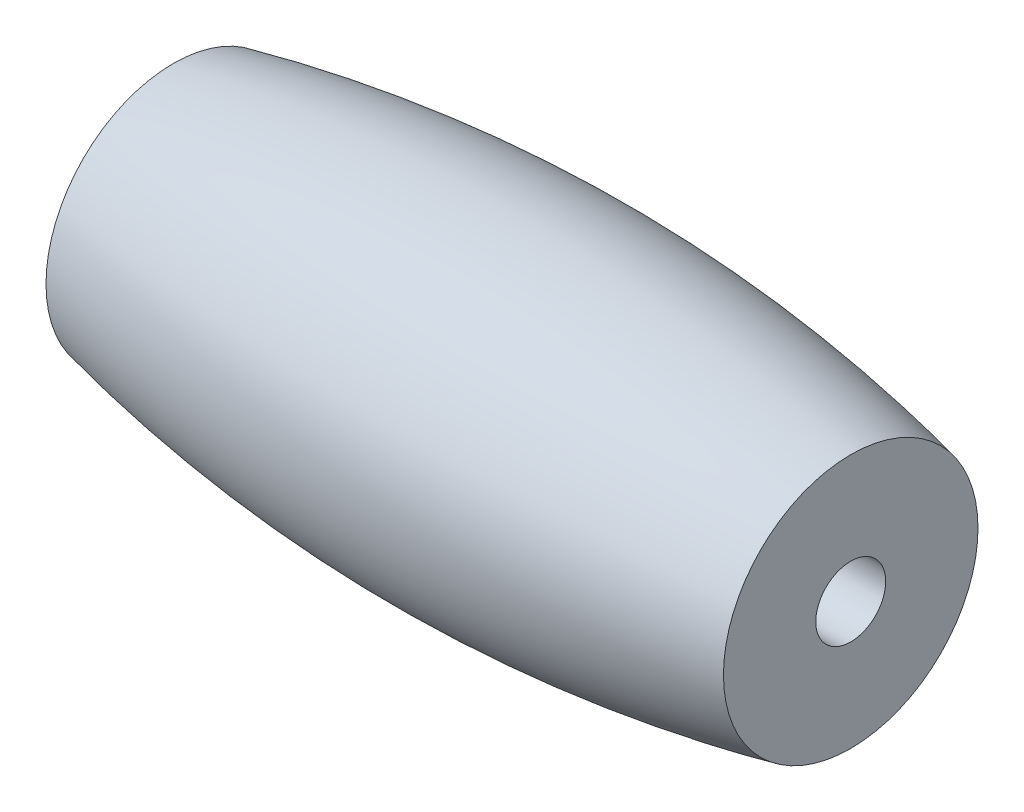
ISO-10303-21;
HEADER;
FILE_DESCRIPTION(('STEP AP214'),'2;1');
FILE_NAME('part.step','',(''),(''),'','','');
FILE_SCHEMA(('AUTOMOTIVE_DESIGN { 1 0 10303 214 1 1 1 1 }'));
ENDSEC;
DATA;
#1=APPLICATION_CONTEXT('core data for automotive mechanical design processes');
#2=APPLICATION_PROTOCOL_DEFINITION('international standard','automotive_design',2000,#1);
#3=PRODUCT_CONTEXT('',#1,'mechanical');
#4=PRODUCT('Part','Part','',(#3));
#5=PRODUCT_RELATED_PRODUCT_CATEGORY('part','',(#4));
#6=PRODUCT_DEFINITION_FORMATION('','',#4);
#7=PRODUCT_DEFINITION_CONTEXT('part definition',#1,'design');
#8=PRODUCT_DEFINITION('design','',#6,#7);
#9=PRODUCT_DEFINITION_SHAPE('','',#8);
#10=(LENGTH_UNIT() NAMED_UNIT(*) SI_UNIT(.MILLI.,.METRE.));
#11=(NAMED_UNIT(*) PLANE_ANGLE_UNIT() SI_UNIT($,.RADIAN.));
#12=(NAMED_UNIT(*) SI_UNIT($,.STERADIAN.) SOLID_ANGLE_UNIT());
#13=UNCERTAINTY_MEASURE_WITH_UNIT(LENGTH_MEASURE(1.E-05),#10,'distance_accuracy_value','');
#14=(GEOMETRIC_REPRESENTATION_CONTEXT(3) GLOBAL_UNCERTAINTY_ASSIGNED_CONTEXT((#13)) GLOBAL_UNIT_ASSIGNED_CONTEXT((#10,
#11,#12)) REPRESENTATION_CONTEXT('',''));
#15=CARTESIAN_POINT('',(0.,0.,0.));
#16=DIRECTION('',(0.,0.,1.));
#17=DIRECTION('',(1.,0.,0.));
#18=AXIS2_PLACEMENT_3D('',#15,#16,#17);
#19=CARTESIAN_POINT('',(-15.5,5.8237248385031,0.));
#20=DIRECTION('',(1.,0.,0.));
#21=DIRECTION('',(0.,0.,-1.));
#22=AXIS2_PLACEMENT_3D('',#19,#20,#21);
#23=PLANE('',#22);
#24=CARTESIAN_POINT('',(-15.5,0.,0.));
#25=DIRECTION('',(-1.,0.,0.));
#26=DIRECTION('',(0.,0.,1.));
#27=AXIS2_PLACEMENT_3D('',#24,#25,#26);
#28=CIRCLE('',#27,1.6);
#29=CARTESIAN_POINT('',(-15.5,0.,1.6));
#30=VERTEX_POINT('',#29);
#31=EDGE_CURVE('E10',#30,#30,#28,.T.);
#32=ORIENTED_EDGE('',*,*,#31,.F.);
#33=EDGE_LOOP('',(#32));
#34=FACE_BOUND('',#33,.T.);
#35=CARTESIAN_POINT('',(-15.5,0.,0.));
#36=DIRECTION('',(-1.,0.,0.));
#37=DIRECTION('',(0.,0.,1.));
#38=AXIS2_PLACEMENT_3D('',#35,#36,#37);
#39=CIRCLE('',#38,5.8237248385031);
#40=CARTESIAN_POINT('',(-15.5,0.,5.8237248385031));
#41=VERTEX_POINT('',#40);
#42=EDGE_CURVE('E60',#41,#41,#39,.T.);
#43=ORIENTED_EDGE('',*,*,#42,.T.);
#44=EDGE_LOOP('',(#43));
#45=FACE_BOUND('',#44,.T.);
#46=ADVANCED_FACE('F43',(#34,#45),#23,.F.);
#47=CARTESIAN_POINT('',(-31.,0.,0.));
#48=DIRECTION('',(-1.,0.,0.));
#49=DIRECTION('',(0.,0.,1.));
#50=AXIS2_PLACEMENT_3D('',#47,#48,#49);
#51=CYLINDRICAL_SURFACE('',#50,1.6);
#52=CARTESIAN_POINT('',(15.5,0.,0.));
#53=DIRECTION('',(-1.,0.,0.));
#54=DIRECTION('',(0.,0.,1.));
#55=AXIS2_PLACEMENT_3D('',#52,#53,#54);
#56=CIRCLE('',#55,1.6);
#57=CARTESIAN_POINT('',(15.5,0.,1.6));
#58=VERTEX_POINT('',#57);
#59=EDGE_CURVE('E50',#58,#58,#56,.T.);
#60=ORIENTED_EDGE('',*,*,#59,.F.);
#61=EDGE_LOOP('',(#60));
#62=FACE_BOUND('',#61,.T.);
#63=ORIENTED_EDGE('',*,*,#31,.T.);
#64=EDGE_LOOP('',(#63));
#65=FACE_BOUND('',#64,.T.);
#66=ADVANCED_FACE('F76',(#62,#65),#51,.F.);
#67=CARTESIAN_POINT('',(15.5,1.6,0.));
#68=DIRECTION('',(-1.,0.,0.));
#69=DIRECTION('',(0.,0.,1.));
#70=AXIS2_PLACEMENT_3D('',#67,#68,#69);
#71=PLANE('',#70);
#72=CARTESIAN_POINT('',(15.5,0.,0.));
#73=DIRECTION('',(-1.,0.,0.));
#74=DIRECTION('',(0.,0.,1.));
#75=AXIS2_PLACEMENT_3D('',#72,#73,#74);
#76=CIRCLE('',#75,5.8237248385031);
#77=CARTESIAN_POINT('',(15.5,0.,5.8237248385031));
#78=VERTEX_POINT('',#77);
#79=EDGE_CURVE('E55',#78,#78,#76,.T.);
#80=ORIENTED_EDGE('',*,*,#79,.F.);
#81=EDGE_LOOP('',(#80));
#82=FACE_BOUND('',#81,.T.);
#83=ORIENTED_EDGE('',*,*,#59,.T.);
#84=EDGE_LOOP('',(#83));
#85=FACE_BOUND('',#84,.T.);
#86=ADVANCED_FACE('F71',(#82,#85),#71,.F.);
#87=CARTESIAN_POINT('',(0.,0.,0.));
#88=DIRECTION('',(-1.,0.,0.));
#89=DIRECTION('',(0.,0.,1.));
#90=AXIS2_PLACEMENT_3D('',#87,#88,#89);
#91=DEGENERATE_TOROIDAL_SURFACE('',#90,65.,72.5,.F.);
#92=ORIENTED_EDGE('',*,*,#42,.F.);
#93=EDGE_LOOP('',(#92));
#94=FACE_BOUND('',#93,.T.);
#95=ORIENTED_EDGE('',*,*,#79,.T.);
#96=EDGE_LOOP('',(#95));
#97=FACE_BOUND('',#96,.T.);
#98=ADVANCED_FACE('F68',(#94,#97),#91,.F.);
#99=CLOSED_SHELL('',(#46,#66,#86,#98));
#100=MANIFOLD_SOLID_BREP('B2',#99);
#101=ADVANCED_BREP_SHAPE_REPRESENTATION('',(#18,#100),#14);
#102=SHAPE_DEFINITION_REPRESENTATION(#9,#101);
ENDSEC;
END-ISO-10303-21;
